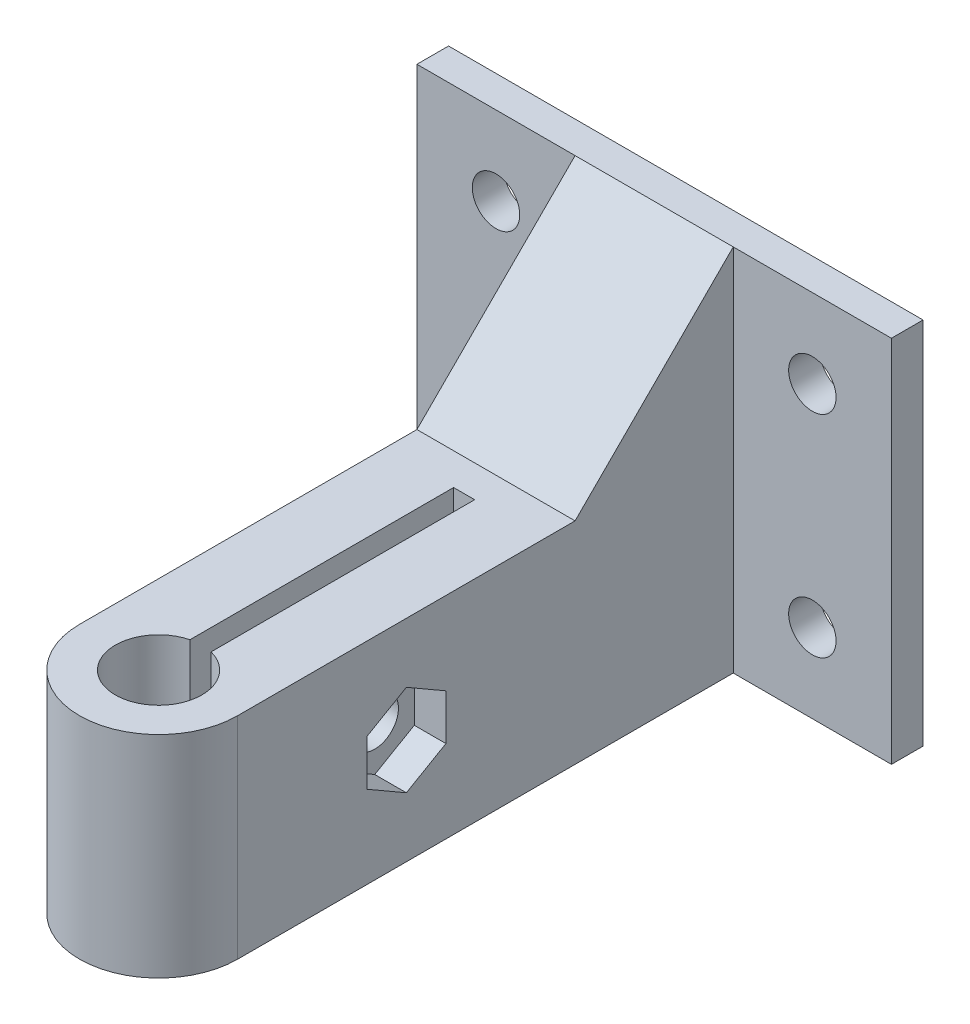
ISO-10303-21;
HEADER;
FILE_DESCRIPTION(('STEP AP214'),'2;1');
FILE_NAME('part.step','',(''),(''),'','','');
FILE_SCHEMA(('AUTOMOTIVE_DESIGN { 1 0 10303 214 1 1 1 1 }'));
ENDSEC;
DATA;
#1=APPLICATION_CONTEXT('core data for automotive mechanical design processes');
#2=APPLICATION_PROTOCOL_DEFINITION('international standard','automotive_design',2000,#1);
#3=PRODUCT_CONTEXT('',#1,'mechanical');
#4=PRODUCT('Part','Part','',(#3));
#5=PRODUCT_RELATED_PRODUCT_CATEGORY('part','',(#4));
#6=PRODUCT_DEFINITION_FORMATION('','',#4);
#7=PRODUCT_DEFINITION_CONTEXT('part definition',#1,'design');
#8=PRODUCT_DEFINITION('design','',#6,#7);
#9=PRODUCT_DEFINITION_SHAPE('','',#8);
#10=(LENGTH_UNIT() NAMED_UNIT(*) SI_UNIT(.MILLI.,.METRE.));
#11=(NAMED_UNIT(*) PLANE_ANGLE_UNIT() SI_UNIT($,.RADIAN.));
#12=(NAMED_UNIT(*) SI_UNIT($,.STERADIAN.) SOLID_ANGLE_UNIT());
#13=UNCERTAINTY_MEASURE_WITH_UNIT(LENGTH_MEASURE(1.E-05),#10,'distance_accuracy_value','');
#14=(GEOMETRIC_REPRESENTATION_CONTEXT(3) GLOBAL_UNCERTAINTY_ASSIGNED_CONTEXT((#13)) GLOBAL_UNIT_ASSIGNED_CONTEXT((#10,
#11,#12)) REPRESENTATION_CONTEXT('',''));
#15=CARTESIAN_POINT('',(0.,0.,0.));
#16=DIRECTION('',(0.,0.,1.));
#17=DIRECTION('',(1.,0.,0.));
#18=AXIS2_PLACEMENT_3D('',#15,#16,#17);
#19=CARTESIAN_POINT('',(0.,0.,3.));
#20=DIRECTION('',(0.,0.,-1.));
#21=DIRECTION('',(-1.,0.,0.));
#22=AXIS2_PLACEMENT_3D('',#19,#20,#21);
#23=PLANE('',#22);
#24=CARTESIAN_POINT('',(15.,4.99999999999999,3.));
#25=DIRECTION('',(0.,0.,1.));
#26=DIRECTION('',(1.,0.,0.));
#27=AXIS2_PLACEMENT_3D('',#24,#25,#26);
#28=CIRCLE('',#27,2.25);
#29=CARTESIAN_POINT('',(17.25,4.99999999999999,3.));
#30=VERTEX_POINT('',#29);
#31=EDGE_CURVE('E302',#30,#30,#28,.T.);
#32=ORIENTED_EDGE('',*,*,#31,.F.);
#33=EDGE_LOOP('',(#32));
#34=FACE_BOUND('',#33,.T.);
#35=CARTESIAN_POINT('',(15.,-15.,3.));
#36=DIRECTION('',(0.,0.,1.));
#37=DIRECTION('',(1.,0.,0.));
#38=AXIS2_PLACEMENT_3D('',#35,#36,#37);
#39=CIRCLE('',#38,2.25);
#40=CARTESIAN_POINT('',(17.25,-15.,3.));
#41=VERTEX_POINT('',#40);
#42=EDGE_CURVE('E296',#41,#41,#39,.T.);
#43=ORIENTED_EDGE('',*,*,#42,.F.);
#44=EDGE_LOOP('',(#43));
#45=FACE_BOUND('',#44,.T.);
#46=DIRECTION('',(0.,1.,0.));
#47=VECTOR('',#46,1.);
#48=CARTESIAN_POINT('',(22.5,-22.5,3.));
#49=LINE('',#48,#47);
#50=CARTESIAN_POINT('',(22.5,-22.5,3.));
#51=VERTEX_POINT('',#50);
#52=CARTESIAN_POINT('',(22.5,12.5000000000001,3.));
#53=VERTEX_POINT('',#52);
#54=EDGE_CURVE('E190',#51,#53,#49,.T.);
#55=ORIENTED_EDGE('',*,*,#54,.T.);
#56=DIRECTION('',(1.,0.,0.));
#57=VECTOR('',#56,1.);
#58=CARTESIAN_POINT('',(22.5,12.5000000000001,3.));
#59=LINE('',#58,#57);
#60=CARTESIAN_POINT('',(7.5,12.5000000000001,3.));
#61=VERTEX_POINT('',#60);
#62=EDGE_CURVE('E183',#61,#53,#59,.T.);
#63=ORIENTED_EDGE('',*,*,#62,.F.);
#64=DIRECTION('',(0.,-1.,0.));
#65=VECTOR('',#64,1.);
#66=CARTESIAN_POINT('',(7.5,-2.5,3.));
#67=LINE('',#66,#65);
#68=CARTESIAN_POINT('',(7.49999999999999,-22.5,3.));
#69=VERTEX_POINT('',#68);
#70=EDGE_CURVE('E286',#61,#69,#67,.T.);
#71=ORIENTED_EDGE('',*,*,#70,.T.);
#72=DIRECTION('',(1.,0.,0.));
#73=VECTOR('',#72,1.);
#74=CARTESIAN_POINT('',(-22.5,-22.5,3.));
#75=LINE('',#74,#73);
#76=EDGE_CURVE('E189',#69,#51,#75,.T.);
#77=ORIENTED_EDGE('',*,*,#76,.T.);
#78=EDGE_LOOP('',(#55,#63,#71,#77));
#79=FACE_BOUND('',#78,.T.);
#80=ADVANCED_FACE('F33',(#34,#45,#79),#23,.F.);
#81=CARTESIAN_POINT('',(12.5,-12.5,34.));
#82=DIRECTION('',(-1.,0.,0.));
#83=DIRECTION('',(0.,0.,1.));
#84=AXIS2_PLACEMENT_3D('',#81,#82,#83);
#85=CYLINDRICAL_SURFACE('',#84,2.25);
#86=CARTESIAN_POINT('',(0.999999999999996,-12.5,34.));
#87=DIRECTION('',(1.,0.,0.));
#88=DIRECTION('',(0.,0.,-1.));
#89=AXIS2_PLACEMENT_3D('',#86,#87,#88);
#90=CIRCLE('',#89,2.25);
#91=CARTESIAN_POINT('',(0.999999999999996,-12.5,31.75));
#92=VERTEX_POINT('',#91);
#93=EDGE_CURVE('E216',#92,#92,#90,.T.);
#94=ORIENTED_EDGE('',*,*,#93,.F.);
#95=EDGE_LOOP('',(#94));
#96=FACE_BOUND('',#95,.T.);
#97=CARTESIAN_POINT('',(4.5,-12.5,34.));
#98=DIRECTION('',(1.,0.,0.));
#99=DIRECTION('',(0.,1.,0.));
#100=AXIS2_PLACEMENT_3D('',#97,#98,#99);
#101=CIRCLE('',#100,2.25);
#102=CARTESIAN_POINT('',(4.5,-10.25,34.));
#103=VERTEX_POINT('',#102);
#104=EDGE_CURVE('E37',#103,#103,#101,.F.);
#105=ORIENTED_EDGE('',*,*,#104,.F.);
#106=EDGE_LOOP('',(#105));
#107=FACE_BOUND('',#106,.T.);
#108=ADVANCED_FACE('F332',(#96,#107),#85,.F.);
#109=CARTESIAN_POINT('',(-15.,-15.,3.));
#110=DIRECTION('',(0.,0.,1.));
#111=DIRECTION('',(1.,0.,0.));
#112=AXIS2_PLACEMENT_3D('',#109,#110,#111);
#113=CIRCLE('',#112,2.25);
#114=CARTESIAN_POINT('',(-12.75,-15.,3.));
#115=VERTEX_POINT('',#114);
#116=EDGE_CURVE('E290',#115,#115,#113,.T.);
#117=ORIENTED_EDGE('',*,*,#116,.F.);
#118=EDGE_LOOP('',(#117));
#119=FACE_BOUND('',#118,.T.);
#120=CARTESIAN_POINT('',(-15.,4.99999999999999,3.));
#121=DIRECTION('',(0.,0.,1.));
#122=DIRECTION('',(1.,0.,0.));
#123=AXIS2_PLACEMENT_3D('',#120,#121,#122);
#124=CIRCLE('',#123,2.25);
#125=CARTESIAN_POINT('',(-12.75,4.99999999999999,3.));
#126=VERTEX_POINT('',#125);
#127=EDGE_CURVE('E204',#126,#126,#124,.T.);
#128=ORIENTED_EDGE('',*,*,#127,.F.);
#129=EDGE_LOOP('',(#128));
#130=FACE_BOUND('',#129,.T.);
#131=DIRECTION('',(0.,-1.,0.));
#132=VECTOR('',#131,1.);
#133=CARTESIAN_POINT('',(-7.5,-2.5,3.));
#134=LINE('',#133,#132);
#135=CARTESIAN_POINT('',(-7.5,12.5000000000001,3.));
#136=VERTEX_POINT('',#135);
#137=CARTESIAN_POINT('',(-7.5,-22.5,3.));
#138=VERTEX_POINT('',#137);
#139=EDGE_CURVE('E182',#136,#138,#134,.T.);
#140=ORIENTED_EDGE('',*,*,#139,.F.);
#141=CARTESIAN_POINT('',(-22.5,12.5000000000001,3.));
#142=VERTEX_POINT('',#141);
#143=EDGE_CURVE('E168',#142,#136,#59,.T.);
#144=ORIENTED_EDGE('',*,*,#143,.F.);
#145=DIRECTION('',(0.,-1.,0.));
#146=VECTOR('',#145,1.);
#147=CARTESIAN_POINT('',(-22.5,-22.5,3.));
#148=LINE('',#147,#146);
#149=CARTESIAN_POINT('',(-22.5,-22.5,3.));
#150=VERTEX_POINT('',#149);
#151=EDGE_CURVE('E180',#142,#150,#148,.T.);
#152=ORIENTED_EDGE('',*,*,#151,.T.);
#153=EDGE_CURVE('E192',#150,#138,#75,.T.);
#154=ORIENTED_EDGE('',*,*,#153,.T.);
#155=EDGE_LOOP('',(#140,#144,#152,#154));
#156=FACE_BOUND('',#155,.T.);
#157=ADVANCED_FACE('F178',(#119,#130,#156),#23,.F.);
#158=CARTESIAN_POINT('',(0.,0.,0.));
#159=DIRECTION('',(0.,0.,-1.));
#160=DIRECTION('',(-1.,0.,0.));
#161=AXIS2_PLACEMENT_3D('',#158,#159,#160);
#162=PLANE('',#161);
#163=DIRECTION('',(-1.,0.,0.));
#164=VECTOR('',#163,1.);
#165=CARTESIAN_POINT('',(0.,12.5000000000001,0.));
#166=LINE('',#165,#164);
#167=CARTESIAN_POINT('',(22.5,12.5000000000001,0.));
#168=VERTEX_POINT('',#167);
#169=CARTESIAN_POINT('',(-22.5,12.5000000000001,0.));
#170=VERTEX_POINT('',#169);
#171=EDGE_CURVE('E171',#168,#170,#166,.T.);
#172=ORIENTED_EDGE('',*,*,#171,.F.);
#173=DIRECTION('',(0.,1.,0.));
#174=VECTOR('',#173,1.);
#175=CARTESIAN_POINT('',(22.5,-22.5,0.));
#176=LINE('',#175,#174);
#177=CARTESIAN_POINT('',(22.5,-22.5,0.));
#178=VERTEX_POINT('',#177);
#179=EDGE_CURVE('E200',#178,#168,#176,.T.);
#180=ORIENTED_EDGE('',*,*,#179,.F.);
#181=DIRECTION('',(1.,0.,0.));
#182=VECTOR('',#181,1.);
#183=CARTESIAN_POINT('',(-22.5,-22.5,0.));
#184=LINE('',#183,#182);
#185=CARTESIAN_POINT('',(-22.5,-22.5,0.));
#186=VERTEX_POINT('',#185);
#187=EDGE_CURVE('E195',#186,#178,#184,.T.);
#188=ORIENTED_EDGE('',*,*,#187,.F.);
#189=DIRECTION('',(0.,-1.,0.));
#190=VECTOR('',#189,1.);
#191=CARTESIAN_POINT('',(-22.5,-22.5,0.));
#192=LINE('',#191,#190);
#193=EDGE_CURVE('E203',#170,#186,#192,.T.);
#194=ORIENTED_EDGE('',*,*,#193,.F.);
#195=EDGE_LOOP('',(#172,#180,#188,#194));
#196=FACE_BOUND('',#195,.T.);
#197=CARTESIAN_POINT('',(15.,-15.,0.));
#198=DIRECTION('',(0.,0.,1.));
#199=DIRECTION('',(1.,0.,0.));
#200=AXIS2_PLACEMENT_3D('',#197,#198,#199);
#201=CIRCLE('',#200,2.25);
#202=CARTESIAN_POINT('',(17.25,-15.,0.));
#203=VERTEX_POINT('',#202);
#204=EDGE_CURVE('E293',#203,#203,#201,.T.);
#205=ORIENTED_EDGE('',*,*,#204,.T.);
#206=EDGE_LOOP('',(#205));
#207=FACE_BOUND('',#206,.T.);
#208=CARTESIAN_POINT('',(-15.,4.99999999999999,0.));
#209=DIRECTION('',(0.,0.,1.));
#210=DIRECTION('',(1.,0.,0.));
#211=AXIS2_PLACEMENT_3D('',#208,#209,#210);
#212=CIRCLE('',#211,2.25);
#213=CARTESIAN_POINT('',(-12.75,4.99999999999999,0.));
#214=VERTEX_POINT('',#213);
#215=EDGE_CURVE('E305',#214,#214,#212,.T.);
#216=ORIENTED_EDGE('',*,*,#215,.T.);
#217=EDGE_LOOP('',(#216));
#218=FACE_BOUND('',#217,.T.);
#219=CARTESIAN_POINT('',(15.,4.99999999999999,0.));
#220=DIRECTION('',(0.,0.,1.));
#221=DIRECTION('',(1.,0.,0.));
#222=AXIS2_PLACEMENT_3D('',#219,#220,#221);
#223=CIRCLE('',#222,2.25);
#224=CARTESIAN_POINT('',(17.25,4.99999999999999,0.));
#225=VERTEX_POINT('',#224);
#226=EDGE_CURVE('E299',#225,#225,#223,.T.);
#227=ORIENTED_EDGE('',*,*,#226,.T.);
#228=EDGE_LOOP('',(#227));
#229=FACE_BOUND('',#228,.T.);
#230=CARTESIAN_POINT('',(-15.,-15.,0.));
#231=DIRECTION('',(0.,0.,1.));
#232=DIRECTION('',(1.,0.,0.));
#233=AXIS2_PLACEMENT_3D('',#230,#231,#232);
#234=CIRCLE('',#233,2.25);
#235=CARTESIAN_POINT('',(-12.75,-15.,0.));
#236=VERTEX_POINT('',#235);
#237=EDGE_CURVE('E283',#236,#236,#234,.T.);
#238=ORIENTED_EDGE('',*,*,#237,.T.);
#239=EDGE_LOOP('',(#238));
#240=FACE_BOUND('',#239,.T.);
#241=ADVANCED_FACE('F312',(#196,#207,#218,#229,#240),#162,.T.);
#242=CARTESIAN_POINT('',(22.5,-22.5,3.));
#243=DIRECTION('',(-1.,0.,0.));
#244=DIRECTION('',(0.,0.,1.));
#245=AXIS2_PLACEMENT_3D('',#242,#243,#244);
#246=PLANE('',#245);
#247=ORIENTED_EDGE('',*,*,#179,.T.);
#248=DIRECTION('',(0.,0.,1.));
#249=VECTOR('',#248,1.);
#250=CARTESIAN_POINT('',(22.5,12.5000000000001,-7.));
#251=LINE('',#250,#249);
#252=EDGE_CURVE('E175',#168,#53,#251,.T.);
#253=ORIENTED_EDGE('',*,*,#252,.T.);
#254=ORIENTED_EDGE('',*,*,#54,.F.);
#255=DIRECTION('',(0.,0.,-1.));
#256=VECTOR('',#255,1.);
#257=CARTESIAN_POINT('',(22.5,-22.5,3.));
#258=LINE('',#257,#256);
#259=EDGE_CURVE('E199',#51,#178,#258,.T.);
#260=ORIENTED_EDGE('',*,*,#259,.T.);
#261=EDGE_LOOP('',(#247,#253,#254,#260));
#262=FACE_BOUND('',#261,.T.);
#263=ADVANCED_FACE('F348',(#262),#246,.F.);
#264=CARTESIAN_POINT('',(-22.5,-22.5,3.));
#265=DIRECTION('',(1.,0.,0.));
#266=DIRECTION('',(0.,0.,-1.));
#267=AXIS2_PLACEMENT_3D('',#264,#265,#266);
#268=PLANE('',#267);
#269=ORIENTED_EDGE('',*,*,#151,.F.);
#270=DIRECTION('',(0.,0.,1.));
#271=VECTOR('',#270,1.);
#272=CARTESIAN_POINT('',(-22.5,12.5000000000001,-7.));
#273=LINE('',#272,#271);
#274=EDGE_CURVE('E165',#170,#142,#273,.T.);
#275=ORIENTED_EDGE('',*,*,#274,.F.);
#276=ORIENTED_EDGE('',*,*,#193,.T.);
#277=DIRECTION('',(0.,0.,-1.));
#278=VECTOR('',#277,1.);
#279=CARTESIAN_POINT('',(-22.5,-22.5,3.));
#280=LINE('',#279,#278);
#281=EDGE_CURVE('E187',#150,#186,#280,.T.);
#282=ORIENTED_EDGE('',*,*,#281,.F.);
#283=EDGE_LOOP('',(#269,#275,#276,#282));
#284=FACE_BOUND('',#283,.T.);
#285=ADVANCED_FACE('F185',(#284),#268,.F.);
#286=CARTESIAN_POINT('',(-22.5,-22.5,3.));
#287=DIRECTION('',(0.,1.,0.));
#288=DIRECTION('',(0.,0.,1.));
#289=AXIS2_PLACEMENT_3D('',#286,#287,#288);
#290=PLANE('',#289);
#291=ORIENTED_EDGE('',*,*,#187,.T.);
#292=ORIENTED_EDGE('',*,*,#259,.F.);
#293=ORIENTED_EDGE('',*,*,#76,.F.);
#294=DIRECTION('',(0.,0.,1.));
#295=VECTOR('',#294,1.);
#296=CARTESIAN_POINT('',(7.5,-22.5,3.));
#297=LINE('',#296,#295);
#298=CARTESIAN_POINT('',(7.49999999999999,-22.5,50.));
#299=VERTEX_POINT('',#298);
#300=EDGE_CURVE('E276',#69,#299,#297,.T.);
#301=ORIENTED_EDGE('',*,*,#300,.T.);
#302=CARTESIAN_POINT('',(0.,-22.5,50.));
#303=DIRECTION('',(0.,-1.,0.));
#304=DIRECTION('',(0.,0.,1.));
#305=AXIS2_PLACEMENT_3D('',#302,#303,#304);
#306=CIRCLE('',#305,7.5);
#307=CARTESIAN_POINT('',(-7.50000000000001,-22.5,50.));
#308=VERTEX_POINT('',#307);
#309=EDGE_CURVE('E269',#299,#308,#306,.T.);
#310=ORIENTED_EDGE('',*,*,#309,.T.);
#311=DIRECTION('',(0.,0.,-1.));
#312=VECTOR('',#311,1.);
#313=CARTESIAN_POINT('',(-7.5,-22.5,3.));
#314=LINE('',#313,#312);
#315=EDGE_CURVE('E258',#308,#138,#314,.T.);
#316=ORIENTED_EDGE('',*,*,#315,.T.);
#317=ORIENTED_EDGE('',*,*,#153,.F.);
#318=ORIENTED_EDGE('',*,*,#281,.T.);
#319=EDGE_LOOP('',(#291,#292,#293,#301,#310,#316,#317,#318));
#320=FACE_BOUND('',#319,.T.);
#321=DIRECTION('',(0.,0.,-1.));
#322=VECTOR('',#321,1.);
#323=CARTESIAN_POINT('',(-1.00000000000001,-22.5,46.0238209295858));
#324=LINE('',#323,#322);
#325=CARTESIAN_POINT('',(-1.00000000000001,-22.5,46.0238209295858));
#326=VERTEX_POINT('',#325);
#327=CARTESIAN_POINT('',(-1.,-22.5,21.0238209295858));
#328=VERTEX_POINT('',#327);
#329=EDGE_CURVE('E248',#326,#328,#324,.T.);
#330=ORIENTED_EDGE('',*,*,#329,.F.);
#331=CARTESIAN_POINT('',(0.,-22.5,50.));
#332=DIRECTION('',(0.,-1.,0.));
#333=DIRECTION('',(0.,0.,-1.));
#334=AXIS2_PLACEMENT_3D('',#331,#332,#333);
#335=CIRCLE('',#334,4.1);
#336=CARTESIAN_POINT('',(0.999999999999994,-22.5,46.0238209295858));
#337=VERTEX_POINT('',#336);
#338=EDGE_CURVE('E221',#337,#326,#335,.T.);
#339=ORIENTED_EDGE('',*,*,#338,.F.);
#340=DIRECTION('',(0.,0.,1.));
#341=VECTOR('',#340,1.);
#342=CARTESIAN_POINT('',(0.999999999999997,-22.5,21.0238209295858));
#343=LINE('',#342,#341);
#344=CARTESIAN_POINT('',(0.999999999999997,-22.5,21.0238209295858));
#345=VERTEX_POINT('',#344);
#346=EDGE_CURVE('E237',#345,#337,#343,.T.);
#347=ORIENTED_EDGE('',*,*,#346,.F.);
#348=DIRECTION('',(1.,0.,0.));
#349=VECTOR('',#348,1.);
#350=CARTESIAN_POINT('',(-1.,-22.5,21.0238209295858));
#351=LINE('',#350,#349);
#352=EDGE_CURVE('E251',#328,#345,#351,.T.);
#353=ORIENTED_EDGE('',*,*,#352,.F.);
#354=EDGE_LOOP('',(#330,#339,#347,#353));
#355=FACE_BOUND('',#354,.T.);
#356=ADVANCED_FACE('F318',(#320,#355),#290,.F.);
#357=CARTESIAN_POINT('',(-15.,4.99999999999999,3.));
#358=DIRECTION('',(0.,0.,-1.));
#359=DIRECTION('',(-1.,0.,0.));
#360=AXIS2_PLACEMENT_3D('',#357,#358,#359);
#361=CYLINDRICAL_SURFACE('',#360,2.25);
#362=ORIENTED_EDGE('',*,*,#127,.T.);
#363=EDGE_LOOP('',(#362));
#364=FACE_BOUND('',#363,.T.);
#365=ORIENTED_EDGE('',*,*,#215,.F.);
#366=EDGE_LOOP('',(#365));
#367=FACE_BOUND('',#366,.T.);
#368=ADVANCED_FACE('F315',(#364,#367),#361,.F.);
#369=CARTESIAN_POINT('',(15.,4.99999999999999,3.));
#370=DIRECTION('',(0.,0.,-1.));
#371=DIRECTION('',(-1.,0.,0.));
#372=AXIS2_PLACEMENT_3D('',#369,#370,#371);
#373=CYLINDRICAL_SURFACE('',#372,2.25);
#374=ORIENTED_EDGE('',*,*,#31,.T.);
#375=EDGE_LOOP('',(#374));
#376=FACE_BOUND('',#375,.T.);
#377=ORIENTED_EDGE('',*,*,#226,.F.);
#378=EDGE_LOOP('',(#377));
#379=FACE_BOUND('',#378,.T.);
#380=ADVANCED_FACE('F317',(#376,#379),#373,.F.);
#381=CARTESIAN_POINT('',(15.,-15.,3.));
#382=DIRECTION('',(0.,0.,-1.));
#383=DIRECTION('',(-1.,0.,0.));
#384=AXIS2_PLACEMENT_3D('',#381,#382,#383);
#385=CYLINDRICAL_SURFACE('',#384,2.25);
#386=ORIENTED_EDGE('',*,*,#42,.T.);
#387=EDGE_LOOP('',(#386));
#388=FACE_BOUND('',#387,.T.);
#389=ORIENTED_EDGE('',*,*,#204,.F.);
#390=EDGE_LOOP('',(#389));
#391=FACE_BOUND('',#390,.T.);
#392=ADVANCED_FACE('F325',(#388,#391),#385,.F.);
#393=CARTESIAN_POINT('',(-15.,-15.,3.));
#394=DIRECTION('',(0.,0.,-1.));
#395=DIRECTION('',(-1.,0.,0.));
#396=AXIS2_PLACEMENT_3D('',#393,#394,#395);
#397=CYLINDRICAL_SURFACE('',#396,2.25);
#398=ORIENTED_EDGE('',*,*,#116,.T.);
#399=EDGE_LOOP('',(#398));
#400=FACE_BOUND('',#399,.T.);
#401=ORIENTED_EDGE('',*,*,#237,.F.);
#402=EDGE_LOOP('',(#401));
#403=FACE_BOUND('',#402,.T.);
#404=ADVANCED_FACE('F354',(#400,#403),#397,.F.);
#405=CARTESIAN_POINT('',(-7.5,-2.5,3.));
#406=DIRECTION('',(-1.,0.,0.));
#407=DIRECTION('',(0.,0.,1.));
#408=AXIS2_PLACEMENT_3D('',#405,#406,#407);
#409=PLANE('',#408);
#410=CARTESIAN_POINT('',(-7.5,-12.5,34.));
#411=DIRECTION('',(-1.,0.,0.));
#412=DIRECTION('',(0.,0.,1.));
#413=AXIS2_PLACEMENT_3D('',#410,#411,#412);
#414=CIRCLE('',#413,2.25);
#415=CARTESIAN_POINT('',(-7.5,-12.5,36.25));
#416=VERTEX_POINT('',#415);
#417=EDGE_CURVE('E217',#416,#416,#414,.T.);
#418=ORIENTED_EDGE('',*,*,#417,.F.);
#419=EDGE_LOOP('',(#418));
#420=FACE_BOUND('',#419,.T.);
#421=ORIENTED_EDGE('',*,*,#315,.F.);
#422=DIRECTION('',(0.,-1.,0.));
#423=VECTOR('',#422,1.);
#424=CARTESIAN_POINT('',(-7.50000000000001,-2.5,50.));
#425=LINE('',#424,#423);
#426=CARTESIAN_POINT('',(-7.50000000000001,-2.5,50.));
#427=VERTEX_POINT('',#426);
#428=EDGE_CURVE('E281',#427,#308,#425,.T.);
#429=ORIENTED_EDGE('',*,*,#428,.F.);
#430=DIRECTION('',(0.,0.,-1.));
#431=VECTOR('',#430,1.);
#432=CARTESIAN_POINT('',(-7.5,-2.5,3.));
#433=LINE('',#432,#431);
#434=CARTESIAN_POINT('',(-7.5,-2.5,17.9999999999999));
#435=VERTEX_POINT('',#434);
#436=EDGE_CURVE('E265',#427,#435,#433,.T.);
#437=ORIENTED_EDGE('',*,*,#436,.T.);
#438=DIRECTION('',(0.,0.707106781186551,-0.707106781186544));
#439=VECTOR('',#438,1.);
#440=CARTESIAN_POINT('',(-7.5,12.5000000000001,3.));
#441=LINE('',#440,#439);
#442=EDGE_CURVE('E11',#435,#136,#441,.T.);
#443=ORIENTED_EDGE('',*,*,#442,.T.);
#444=ORIENTED_EDGE('',*,*,#139,.T.);
#445=EDGE_LOOP('',(#421,#429,#437,#443,#444));
#446=FACE_BOUND('',#445,.T.);
#447=ADVANCED_FACE('F357',(#420,#446),#409,.T.);
#448=CARTESIAN_POINT('',(0.,-2.5,50.));
#449=DIRECTION('',(0.,-1.,0.));
#450=DIRECTION('',(0.,0.,-1.));
#451=AXIS2_PLACEMENT_3D('',#448,#449,#450);
#452=CYLINDRICAL_SURFACE('',#451,7.5);
#453=ORIENTED_EDGE('',*,*,#309,.F.);
#454=DIRECTION('',(0.,-1.,0.));
#455=VECTOR('',#454,1.);
#456=CARTESIAN_POINT('',(7.49999999999999,-2.5,50.));
#457=LINE('',#456,#455);
#458=CARTESIAN_POINT('',(7.49999999999999,-2.5,50.));
#459=VERTEX_POINT('',#458);
#460=EDGE_CURVE('E284',#459,#299,#457,.T.);
#461=ORIENTED_EDGE('',*,*,#460,.F.);
#462=CARTESIAN_POINT('',(0.,-2.5,50.));
#463=DIRECTION('',(0.,-1.,0.));
#464=DIRECTION('',(0.,0.,1.));
#465=AXIS2_PLACEMENT_3D('',#462,#463,#464);
#466=CIRCLE('',#465,7.5);
#467=EDGE_CURVE('E271',#459,#427,#466,.T.);
#468=ORIENTED_EDGE('',*,*,#467,.T.);
#469=ORIENTED_EDGE('',*,*,#428,.T.);
#470=EDGE_LOOP('',(#453,#461,#468,#469));
#471=FACE_BOUND('',#470,.T.);
#472=ADVANCED_FACE('F365',(#471),#452,.T.);
#473=CARTESIAN_POINT('',(7.5,-2.5,3.));
#474=DIRECTION('',(1.,0.,0.));
#475=DIRECTION('',(0.,0.,-1.));
#476=AXIS2_PLACEMENT_3D('',#473,#474,#475);
#477=PLANE('',#476);
#478=DIRECTION('',(0.,-0.5,-0.866025403784439));
#479=VECTOR('',#478,1.);
#480=CARTESIAN_POINT('',(7.5,-14.6650635094611,37.75));
#481=LINE('',#480,#479);
#482=CARTESIAN_POINT('',(7.5,-14.6650635094611,37.75));
#483=VERTEX_POINT('',#482);
#484=CARTESIAN_POINT('',(7.5,-16.8301270189222,34.));
#485=VERTEX_POINT('',#484);
#486=EDGE_CURVE('E50',#483,#485,#481,.T.);
#487=ORIENTED_EDGE('',*,*,#486,.F.);
#488=DIRECTION('',(0.,-1.,0.));
#489=VECTOR('',#488,1.);
#490=CARTESIAN_POINT('',(7.5,-10.3349364905389,37.75));
#491=LINE('',#490,#489);
#492=CARTESIAN_POINT('',(7.5,-10.3349364905389,37.75));
#493=VERTEX_POINT('',#492);
#494=EDGE_CURVE('E616',#493,#483,#491,.T.);
#495=ORIENTED_EDGE('',*,*,#494,.F.);
#496=DIRECTION('',(0.,-0.5,0.866025403784438));
#497=VECTOR('',#496,1.);
#498=CARTESIAN_POINT('',(7.5,-8.1698729810778,34.));
#499=LINE('',#498,#497);
#500=CARTESIAN_POINT('',(7.5,-8.1698729810778,34.));
#501=VERTEX_POINT('',#500);
#502=EDGE_CURVE('E639',#501,#493,#499,.T.);
#503=ORIENTED_EDGE('',*,*,#502,.F.);
#504=DIRECTION('',(0.,0.5,0.866025403784439));
#505=VECTOR('',#504,1.);
#506=CARTESIAN_POINT('',(7.5,-10.3349364905389,30.25));
#507=LINE('',#506,#505);
#508=CARTESIAN_POINT('',(7.5,-10.3349364905389,30.25));
#509=VERTEX_POINT('',#508);
#510=EDGE_CURVE('E636',#509,#501,#507,.T.);
#511=ORIENTED_EDGE('',*,*,#510,.F.);
#512=DIRECTION('',(0.,1.,0.));
#513=VECTOR('',#512,1.);
#514=CARTESIAN_POINT('',(7.5,-14.6650635094611,30.25));
#515=LINE('',#514,#513);
#516=CARTESIAN_POINT('',(7.5,-14.6650635094611,30.25));
#517=VERTEX_POINT('',#516);
#518=EDGE_CURVE('E633',#517,#509,#515,.T.);
#519=ORIENTED_EDGE('',*,*,#518,.F.);
#520=DIRECTION('',(0.,0.5,-0.866025403784439));
#521=VECTOR('',#520,1.);
#522=CARTESIAN_POINT('',(7.5,-16.8301270189222,34.));
#523=LINE('',#522,#521);
#524=EDGE_CURVE('E608',#485,#517,#523,.T.);
#525=ORIENTED_EDGE('',*,*,#524,.F.);
#526=EDGE_LOOP('',(#487,#495,#503,#511,#519,#525));
#527=FACE_BOUND('',#526,.T.);
#528=ORIENTED_EDGE('',*,*,#300,.F.);
#529=ORIENTED_EDGE('',*,*,#70,.F.);
#530=DIRECTION('',(0.,-0.707106781186551,0.707106781186544));
#531=VECTOR('',#530,1.);
#532=CARTESIAN_POINT('',(7.5,12.5000000000001,3.));
#533=LINE('',#532,#531);
#534=CARTESIAN_POINT('',(7.5,-2.5,17.9999999999999));
#535=VERTEX_POINT('',#534);
#536=EDGE_CURVE('E42',#61,#535,#533,.T.);
#537=ORIENTED_EDGE('',*,*,#536,.T.);
#538=DIRECTION('',(0.,0.,1.));
#539=VECTOR('',#538,1.);
#540=CARTESIAN_POINT('',(7.5,-2.5,3.));
#541=LINE('',#540,#539);
#542=EDGE_CURVE('E268',#535,#459,#541,.T.);
#543=ORIENTED_EDGE('',*,*,#542,.T.);
#544=ORIENTED_EDGE('',*,*,#460,.T.);
#545=EDGE_LOOP('',(#528,#529,#537,#543,#544));
#546=FACE_BOUND('',#545,.T.);
#547=ADVANCED_FACE('F371',(#527,#546),#477,.T.);
#548=CARTESIAN_POINT('',(0.,-2.5,50.));
#549=DIRECTION('',(0.,1.,0.));
#550=DIRECTION('',(0.,0.,1.));
#551=AXIS2_PLACEMENT_3D('',#548,#549,#550);
#552=PLANE('',#551);
#553=CARTESIAN_POINT('',(0.,-2.5,50.));
#554=DIRECTION('',(0.,-1.,0.));
#555=DIRECTION('',(0.,0.,-1.));
#556=AXIS2_PLACEMENT_3D('',#553,#554,#555);
#557=CIRCLE('',#556,4.1);
#558=CARTESIAN_POINT('',(0.999999999999994,-2.5,46.0238209295858));
#559=VERTEX_POINT('',#558);
#560=CARTESIAN_POINT('',(-1.00000000000001,-2.5,46.0238209295858));
#561=VERTEX_POINT('',#560);
#562=EDGE_CURVE('E233',#559,#561,#557,.T.);
#563=ORIENTED_EDGE('',*,*,#562,.T.);
#564=DIRECTION('',(0.,0.,-1.));
#565=VECTOR('',#564,1.);
#566=CARTESIAN_POINT('',(-1.00000000000001,-2.5,46.0238209295858));
#567=LINE('',#566,#565);
#568=CARTESIAN_POINT('',(-1.,-2.5,21.0238209295858));
#569=VERTEX_POINT('',#568);
#570=EDGE_CURVE('E236',#561,#569,#567,.T.);
#571=ORIENTED_EDGE('',*,*,#570,.T.);
#572=DIRECTION('',(1.,0.,0.));
#573=VECTOR('',#572,1.);
#574=CARTESIAN_POINT('',(-1.,-2.5,21.0238209295858));
#575=LINE('',#574,#573);
#576=CARTESIAN_POINT('',(0.999999999999997,-2.5,21.0238209295858));
#577=VERTEX_POINT('',#576);
#578=EDGE_CURVE('E240',#569,#577,#575,.T.);
#579=ORIENTED_EDGE('',*,*,#578,.T.);
#580=DIRECTION('',(0.,0.,1.));
#581=VECTOR('',#580,1.);
#582=CARTESIAN_POINT('',(0.999999999999997,-2.5,21.0238209295858));
#583=LINE('',#582,#581);
#584=EDGE_CURVE('E243',#577,#559,#583,.T.);
#585=ORIENTED_EDGE('',*,*,#584,.T.);
#586=EDGE_LOOP('',(#563,#571,#579,#585));
#587=FACE_BOUND('',#586,.T.);
#588=ORIENTED_EDGE('',*,*,#542,.F.);
#589=DIRECTION('',(-1.,0.,0.));
#590=VECTOR('',#589,1.);
#591=CARTESIAN_POINT('',(0.,-2.5,17.9999999999999));
#592=LINE('',#591,#590);
#593=EDGE_CURVE('E212',#535,#435,#592,.T.);
#594=ORIENTED_EDGE('',*,*,#593,.T.);
#595=ORIENTED_EDGE('',*,*,#436,.F.);
#596=ORIENTED_EDGE('',*,*,#467,.F.);
#597=EDGE_LOOP('',(#588,#594,#595,#596));
#598=FACE_BOUND('',#597,.T.);
#599=ADVANCED_FACE('F374',(#587,#598),#552,.T.);
#600=CARTESIAN_POINT('',(0.,-2.5,50.));
#601=DIRECTION('',(0.,-1.,0.));
#602=DIRECTION('',(0.,0.,-1.));
#603=AXIS2_PLACEMENT_3D('',#600,#601,#602);
#604=CYLINDRICAL_SURFACE('',#603,4.1);
#605=ORIENTED_EDGE('',*,*,#338,.T.);
#606=DIRECTION('',(0.,-1.,0.));
#607=VECTOR('',#606,1.);
#608=CARTESIAN_POINT('',(-1.00000000000001,-2.5,46.0238209295858));
#609=LINE('',#608,#607);
#610=EDGE_CURVE('E246',#561,#326,#609,.T.);
#611=ORIENTED_EDGE('',*,*,#610,.F.);
#612=ORIENTED_EDGE('',*,*,#562,.F.);
#613=DIRECTION('',(0.,-1.,0.));
#614=VECTOR('',#613,1.);
#615=CARTESIAN_POINT('',(0.999999999999994,-2.5,46.0238209295858));
#616=LINE('',#615,#614);
#617=EDGE_CURVE('E256',#559,#337,#616,.T.);
#618=ORIENTED_EDGE('',*,*,#617,.T.);
#619=EDGE_LOOP('',(#605,#611,#612,#618));
#620=FACE_BOUND('',#619,.T.);
#621=ADVANCED_FACE('F381',(#620),#604,.F.);
#622=CARTESIAN_POINT('',(0.999999999999997,-2.5,21.0238209295858));
#623=DIRECTION('',(1.,0.,0.));
#624=DIRECTION('',(0.,0.,-1.));
#625=AXIS2_PLACEMENT_3D('',#622,#623,#624);
#626=PLANE('',#625);
#627=ORIENTED_EDGE('',*,*,#93,.T.);
#628=EDGE_LOOP('',(#627));
#629=FACE_BOUND('',#628,.T.);
#630=ORIENTED_EDGE('',*,*,#346,.T.);
#631=ORIENTED_EDGE('',*,*,#617,.F.);
#632=ORIENTED_EDGE('',*,*,#584,.F.);
#633=DIRECTION('',(0.,-1.,0.));
#634=VECTOR('',#633,1.);
#635=CARTESIAN_POINT('',(0.999999999999997,-2.5,21.0238209295858));
#636=LINE('',#635,#634);
#637=EDGE_CURVE('E259',#577,#345,#636,.T.);
#638=ORIENTED_EDGE('',*,*,#637,.T.);
#639=EDGE_LOOP('',(#630,#631,#632,#638));
#640=FACE_BOUND('',#639,.T.);
#641=ADVANCED_FACE('F385',(#629,#640),#626,.F.);
#642=CARTESIAN_POINT('',(-1.,-2.5,21.0238209295858));
#643=DIRECTION('',(0.,0.,-1.));
#644=DIRECTION('',(-1.,0.,0.));
#645=AXIS2_PLACEMENT_3D('',#642,#643,#644);
#646=PLANE('',#645);
#647=ORIENTED_EDGE('',*,*,#352,.T.);
#648=ORIENTED_EDGE('',*,*,#637,.F.);
#649=ORIENTED_EDGE('',*,*,#578,.F.);
#650=DIRECTION('',(0.,-1.,0.));
#651=VECTOR('',#650,1.);
#652=CARTESIAN_POINT('',(-1.,-2.5,21.0238209295858));
#653=LINE('',#652,#651);
#654=EDGE_CURVE('E261',#569,#328,#653,.T.);
#655=ORIENTED_EDGE('',*,*,#654,.T.);
#656=EDGE_LOOP('',(#647,#648,#649,#655));
#657=FACE_BOUND('',#656,.T.);
#658=ADVANCED_FACE('F390',(#657),#646,.F.);
#659=CARTESIAN_POINT('',(-1.00000000000001,-2.5,46.0238209295858));
#660=DIRECTION('',(-1.,0.,0.));
#661=DIRECTION('',(0.,0.,1.));
#662=AXIS2_PLACEMENT_3D('',#659,#660,#661);
#663=PLANE('',#662);
#664=CARTESIAN_POINT('',(-1.,-12.5,34.));
#665=DIRECTION('',(-1.,0.,0.));
#666=DIRECTION('',(0.,0.,1.));
#667=AXIS2_PLACEMENT_3D('',#664,#665,#666);
#668=CIRCLE('',#667,2.25);
#669=CARTESIAN_POINT('',(-1.,-12.5,36.25));
#670=VERTEX_POINT('',#669);
#671=EDGE_CURVE('E214',#670,#670,#668,.T.);
#672=ORIENTED_EDGE('',*,*,#671,.T.);
#673=EDGE_LOOP('',(#672));
#674=FACE_BOUND('',#673,.T.);
#675=ORIENTED_EDGE('',*,*,#329,.T.);
#676=ORIENTED_EDGE('',*,*,#654,.F.);
#677=ORIENTED_EDGE('',*,*,#570,.F.);
#678=ORIENTED_EDGE('',*,*,#610,.T.);
#679=EDGE_LOOP('',(#675,#676,#677,#678));
#680=FACE_BOUND('',#679,.T.);
#681=ADVANCED_FACE('F387',(#674,#680),#663,.F.);
#682=CARTESIAN_POINT('',(0.,12.5000000000001,3.));
#683=DIRECTION('',(0.,-0.707106781186544,-0.707106781186551));
#684=DIRECTION('',(1.,0.,0.));
#685=AXIS2_PLACEMENT_3D('',#682,#683,#684);
#686=PLANE('',#685);
#687=ORIENTED_EDGE('',*,*,#442,.F.);
#688=ORIENTED_EDGE('',*,*,#593,.F.);
#689=ORIENTED_EDGE('',*,*,#536,.F.);
#690=DIRECTION('',(1.,0.,0.));
#691=VECTOR('',#690,1.);
#692=CARTESIAN_POINT('',(0.,12.5000000000001,3.));
#693=LINE('',#692,#691);
#694=EDGE_CURVE('E210',#136,#61,#693,.T.);
#695=ORIENTED_EDGE('',*,*,#694,.F.);
#696=EDGE_LOOP('',(#687,#688,#689,#695));
#697=FACE_BOUND('',#696,.T.);
#698=ADVANCED_FACE('F35',(#697),#686,.F.);
#699=ORIENTED_EDGE('',*,*,#417,.T.);
#700=EDGE_LOOP('',(#699));
#701=FACE_BOUND('',#700,.T.);
#702=ORIENTED_EDGE('',*,*,#671,.F.);
#703=EDGE_LOOP('',(#702));
#704=FACE_BOUND('',#703,.T.);
#705=ADVANCED_FACE('F339',(#701,#704),#85,.F.);
#706=CARTESIAN_POINT('',(4.5,0.,0.));
#707=DIRECTION('',(1.,0.,0.));
#708=DIRECTION('',(0.,1.,0.));
#709=AXIS2_PLACEMENT_3D('',#706,#707,#708);
#710=PLANE('',#709);
#711=DIRECTION('',(0.,-0.5,-0.866025403784439));
#712=VECTOR('',#711,1.);
#713=CARTESIAN_POINT('',(4.5,-14.6650635094611,37.75));
#714=LINE('',#713,#712);
#715=CARTESIAN_POINT('',(4.5,-14.6650635094611,37.75));
#716=VERTEX_POINT('',#715);
#717=CARTESIAN_POINT('',(4.5,-16.8301270189222,34.));
#718=VERTEX_POINT('',#717);
#719=EDGE_CURVE('E612',#716,#718,#714,.T.);
#720=ORIENTED_EDGE('',*,*,#719,.T.);
#721=DIRECTION('',(0.,0.5,-0.866025403784439));
#722=VECTOR('',#721,1.);
#723=CARTESIAN_POINT('',(4.5,-16.8301270189222,34.));
#724=LINE('',#723,#722);
#725=CARTESIAN_POINT('',(4.5,-14.6650635094611,30.25));
#726=VERTEX_POINT('',#725);
#727=EDGE_CURVE('E615',#718,#726,#724,.T.);
#728=ORIENTED_EDGE('',*,*,#727,.T.);
#729=DIRECTION('',(0.,1.,0.));
#730=VECTOR('',#729,1.);
#731=CARTESIAN_POINT('',(4.5,-14.6650635094611,30.25));
#732=LINE('',#731,#730);
#733=CARTESIAN_POINT('',(4.5,-10.3349364905389,30.25));
#734=VERTEX_POINT('',#733);
#735=EDGE_CURVE('E619',#726,#734,#732,.T.);
#736=ORIENTED_EDGE('',*,*,#735,.T.);
#737=DIRECTION('',(0.,0.5,0.866025403784439));
#738=VECTOR('',#737,1.);
#739=CARTESIAN_POINT('',(4.5,-10.3349364905389,30.25));
#740=LINE('',#739,#738);
#741=CARTESIAN_POINT('',(4.5,-8.1698729810778,34.));
#742=VERTEX_POINT('',#741);
#743=EDGE_CURVE('E622',#734,#742,#740,.T.);
#744=ORIENTED_EDGE('',*,*,#743,.T.);
#745=DIRECTION('',(0.,-0.5,0.866025403784438));
#746=VECTOR('',#745,1.);
#747=CARTESIAN_POINT('',(4.5,-8.1698729810778,34.));
#748=LINE('',#747,#746);
#749=CARTESIAN_POINT('',(4.5,-10.3349364905389,37.75));
#750=VERTEX_POINT('',#749);
#751=EDGE_CURVE('E625',#742,#750,#748,.T.);
#752=ORIENTED_EDGE('',*,*,#751,.T.);
#753=DIRECTION('',(0.,-1.,0.));
#754=VECTOR('',#753,1.);
#755=CARTESIAN_POINT('',(4.5,-10.3349364905389,37.75));
#756=LINE('',#755,#754);
#757=EDGE_CURVE('E628',#750,#716,#756,.T.);
#758=ORIENTED_EDGE('',*,*,#757,.T.);
#759=EDGE_LOOP('',(#720,#728,#736,#744,#752,#758));
#760=FACE_BOUND('',#759,.T.);
#761=ORIENTED_EDGE('',*,*,#104,.T.);
#762=EDGE_LOOP('',(#761));
#763=FACE_BOUND('',#762,.T.);
#764=ADVANCED_FACE('F401',(#760,#763),#710,.T.);
#765=CARTESIAN_POINT('',(4.5,-14.6650635094611,37.75));
#766=DIRECTION('',(0.,-0.866025403784439,0.5));
#767=DIRECTION('',(0.,-0.5,-0.866025403784439));
#768=AXIS2_PLACEMENT_3D('',#765,#766,#767);
#769=PLANE('',#768);
#770=ORIENTED_EDGE('',*,*,#486,.T.);
#771=DIRECTION('',(1.,0.,0.));
#772=VECTOR('',#771,1.);
#773=CARTESIAN_POINT('',(4.5,-16.8301270189222,34.));
#774=LINE('',#773,#772);
#775=EDGE_CURVE('E230',#718,#485,#774,.T.);
#776=ORIENTED_EDGE('',*,*,#775,.F.);
#777=ORIENTED_EDGE('',*,*,#719,.F.);
#778=DIRECTION('',(1.,0.,0.));
#779=VECTOR('',#778,1.);
#780=CARTESIAN_POINT('',(4.5,-14.6650635094611,37.75));
#781=LINE('',#780,#779);
#782=EDGE_CURVE('E228',#716,#483,#781,.T.);
#783=ORIENTED_EDGE('',*,*,#782,.T.);
#784=EDGE_LOOP('',(#770,#776,#777,#783));
#785=FACE_BOUND('',#784,.T.);
#786=ADVANCED_FACE('F397',(#785),#769,.F.);
#787=CARTESIAN_POINT('',(4.5,-10.3349364905389,37.75));
#788=DIRECTION('',(0.,0.,1.));
#789=DIRECTION('',(1.,0.,0.));
#790=AXIS2_PLACEMENT_3D('',#787,#788,#789);
#791=PLANE('',#790);
#792=ORIENTED_EDGE('',*,*,#494,.T.);
#793=ORIENTED_EDGE('',*,*,#782,.F.);
#794=ORIENTED_EDGE('',*,*,#757,.F.);
#795=DIRECTION('',(1.,0.,0.));
#796=VECTOR('',#795,1.);
#797=CARTESIAN_POINT('',(4.5,-10.3349364905389,37.75));
#798=LINE('',#797,#796);
#799=EDGE_CURVE('E645',#750,#493,#798,.T.);
#800=ORIENTED_EDGE('',*,*,#799,.T.);
#801=EDGE_LOOP('',(#792,#793,#794,#800));
#802=FACE_BOUND('',#801,.T.);
#803=ADVANCED_FACE('F400',(#802),#791,.F.);
#804=CARTESIAN_POINT('',(4.5,-8.1698729810778,34.));
#805=DIRECTION('',(0.,0.866025403784438,0.5));
#806=DIRECTION('',(0.,-0.5,0.866025403784438));
#807=AXIS2_PLACEMENT_3D('',#804,#805,#806);
#808=PLANE('',#807);
#809=ORIENTED_EDGE('',*,*,#502,.T.);
#810=ORIENTED_EDGE('',*,*,#799,.F.);
#811=ORIENTED_EDGE('',*,*,#751,.F.);
#812=DIRECTION('',(1.,0.,0.));
#813=VECTOR('',#812,1.);
#814=CARTESIAN_POINT('',(4.5,-8.1698729810778,34.));
#815=LINE('',#814,#813);
#816=EDGE_CURVE('E647',#742,#501,#815,.T.);
#817=ORIENTED_EDGE('',*,*,#816,.T.);
#818=EDGE_LOOP('',(#809,#810,#811,#817));
#819=FACE_BOUND('',#818,.T.);
#820=ADVANCED_FACE('F413',(#819),#808,.F.);
#821=CARTESIAN_POINT('',(4.5,-10.3349364905389,30.25));
#822=DIRECTION('',(0.,0.866025403784439,-0.5));
#823=DIRECTION('',(0.,0.5,0.866025403784439));
#824=AXIS2_PLACEMENT_3D('',#821,#822,#823);
#825=PLANE('',#824);
#826=ORIENTED_EDGE('',*,*,#510,.T.);
#827=ORIENTED_EDGE('',*,*,#816,.F.);
#828=ORIENTED_EDGE('',*,*,#743,.F.);
#829=DIRECTION('',(1.,0.,0.));
#830=VECTOR('',#829,1.);
#831=CARTESIAN_POINT('',(4.5,-10.3349364905389,30.25));
#832=LINE('',#831,#830);
#833=EDGE_CURVE('E649',#734,#509,#832,.T.);
#834=ORIENTED_EDGE('',*,*,#833,.T.);
#835=EDGE_LOOP('',(#826,#827,#828,#834));
#836=FACE_BOUND('',#835,.T.);
#837=ADVANCED_FACE('F409',(#836),#825,.F.);
#838=CARTESIAN_POINT('',(4.5,-14.6650635094611,30.25));
#839=DIRECTION('',(0.,0.,-1.));
#840=DIRECTION('',(0.,1.,0.));
#841=AXIS2_PLACEMENT_3D('',#838,#839,#840);
#842=PLANE('',#841);
#843=ORIENTED_EDGE('',*,*,#518,.T.);
#844=ORIENTED_EDGE('',*,*,#833,.F.);
#845=ORIENTED_EDGE('',*,*,#735,.F.);
#846=DIRECTION('',(1.,0.,0.));
#847=VECTOR('',#846,1.);
#848=CARTESIAN_POINT('',(4.5,-14.6650635094611,30.25));
#849=LINE('',#848,#847);
#850=EDGE_CURVE('E650',#726,#517,#849,.T.);
#851=ORIENTED_EDGE('',*,*,#850,.T.);
#852=EDGE_LOOP('',(#843,#844,#845,#851));
#853=FACE_BOUND('',#852,.T.);
#854=ADVANCED_FACE('F405',(#853),#842,.F.);
#855=CARTESIAN_POINT('',(4.5,-16.8301270189222,34.));
#856=DIRECTION('',(0.,-0.866025403784439,-0.5));
#857=DIRECTION('',(0.,0.5,-0.866025403784439));
#858=AXIS2_PLACEMENT_3D('',#855,#856,#857);
#859=PLANE('',#858);
#860=ORIENTED_EDGE('',*,*,#524,.T.);
#861=ORIENTED_EDGE('',*,*,#850,.F.);
#862=ORIENTED_EDGE('',*,*,#727,.F.);
#863=ORIENTED_EDGE('',*,*,#775,.T.);
#864=EDGE_LOOP('',(#860,#861,#862,#863));
#865=FACE_BOUND('',#864,.T.);
#866=ADVANCED_FACE('F402',(#865),#859,.F.);
#867=CARTESIAN_POINT('',(22.5,12.5000000000001,-7.));
#868=DIRECTION('',(0.,-1.,0.));
#869=DIRECTION('',(0.,0.,-1.));
#870=AXIS2_PLACEMENT_3D('',#867,#868,#869);
#871=PLANE('',#870);
#872=ORIENTED_EDGE('',*,*,#171,.T.);
#873=ORIENTED_EDGE('',*,*,#274,.T.);
#874=ORIENTED_EDGE('',*,*,#143,.T.);
#875=ORIENTED_EDGE('',*,*,#694,.T.);
#876=ORIENTED_EDGE('',*,*,#62,.T.);
#877=ORIENTED_EDGE('',*,*,#252,.F.);
#878=EDGE_LOOP('',(#872,#873,#874,#875,#876,#877));
#879=FACE_BOUND('',#878,.T.);
#880=ADVANCED_FACE('F167',(#879),#871,.F.);
#881=CLOSED_SHELL('',(#80,#108,#157,#241,#263,#285,#356,#368,#380,#392,#404,#447,#472,#547,#599,
#621,#641,#658,#681,#698,#705,#764,#786,#803,#820,#837,#854,#866,#880));
#882=MANIFOLD_SOLID_BREP('B2',#881);
#883=ADVANCED_BREP_SHAPE_REPRESENTATION('',(#18,#882),#14);
#884=SHAPE_DEFINITION_REPRESENTATION(#9,#883);
ENDSEC;
END-ISO-10303-21;
